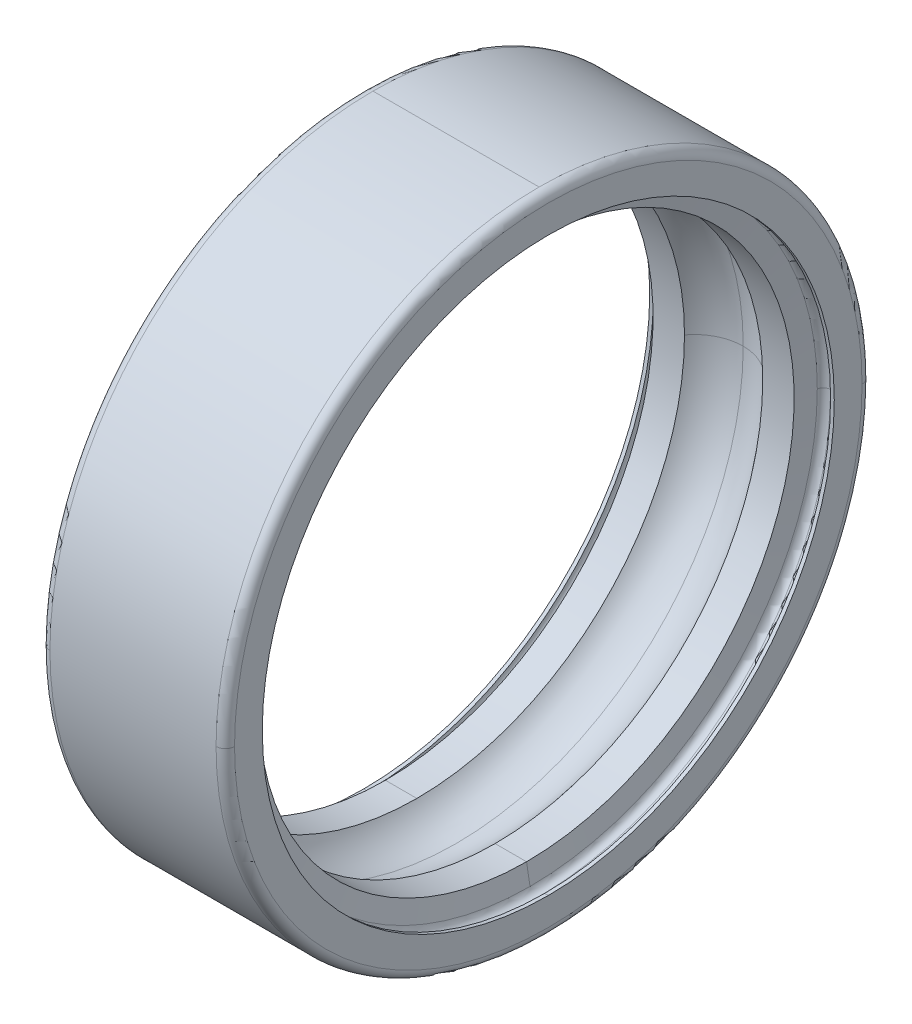
ISO-10303-21;
HEADER;
FILE_DESCRIPTION(('STEP AP214'),'2;1');
FILE_NAME('part.step','',(''),(''),'','','');
FILE_SCHEMA(('AUTOMOTIVE_DESIGN { 1 0 10303 214 1 1 1 1 }'));
ENDSEC;
DATA;
#1=APPLICATION_CONTEXT('core data for automotive mechanical design processes');
#2=APPLICATION_PROTOCOL_DEFINITION('international standard','automotive_design',2000,#1);
#3=PRODUCT_CONTEXT('',#1,'mechanical');
#4=PRODUCT('Part','Part','',(#3));
#5=PRODUCT_RELATED_PRODUCT_CATEGORY('part','',(#4));
#6=PRODUCT_DEFINITION_FORMATION('','',#4);
#7=PRODUCT_DEFINITION_CONTEXT('part definition',#1,'design');
#8=PRODUCT_DEFINITION('design','',#6,#7);
#9=PRODUCT_DEFINITION_SHAPE('','',#8);
#10=(LENGTH_UNIT() NAMED_UNIT(*) SI_UNIT(.MILLI.,.METRE.));
#11=(NAMED_UNIT(*) PLANE_ANGLE_UNIT() SI_UNIT($,.RADIAN.));
#12=(NAMED_UNIT(*) SI_UNIT($,.STERADIAN.) SOLID_ANGLE_UNIT());
#13=UNCERTAINTY_MEASURE_WITH_UNIT(LENGTH_MEASURE(1.E-05),#10,'distance_accuracy_value','');
#14=(GEOMETRIC_REPRESENTATION_CONTEXT(3) GLOBAL_UNCERTAINTY_ASSIGNED_CONTEXT((#13)) GLOBAL_UNIT_ASSIGNED_CONTEXT((#10,
#11,#12)) REPRESENTATION_CONTEXT('',''));
#15=CARTESIAN_POINT('',(0.,0.,0.));
#16=DIRECTION('',(0.,0.,1.));
#17=DIRECTION('',(1.,0.,0.));
#18=AXIS2_PLACEMENT_3D('',#15,#16,#17);
#19=CARTESIAN_POINT('',(11.283,0.,0.));
#20=DIRECTION('',(1.,0.,0.));
#21=DIRECTION('',(0.,0.,-1.));
#22=AXIS2_PLACEMENT_3D('',#19,#20,#21);
#23=TOROIDAL_SURFACE('',#22,18.595,0.478);
#24=CARTESIAN_POINT('',(11.283,0.,0.));
#25=DIRECTION('',(1.,0.,0.));
#26=DIRECTION('',(0.,0.,1.));
#27=AXIS2_PLACEMENT_3D('',#24,#25,#26);
#28=CIRCLE('',#27,19.073);
#29=CARTESIAN_POINT('',(11.283,0.,-19.073));
#30=VERTEX_POINT('',#29);
#31=CARTESIAN_POINT('',(11.283,0.,19.073));
#32=VERTEX_POINT('',#31);
#33=EDGE_CURVE('E452',#30,#32,#28,.T.);
#34=ORIENTED_EDGE('',*,*,#33,.T.);
#35=CARTESIAN_POINT('',(11.283,0.,18.595));
#36=DIRECTION('',(0.,-1.,0.));
#37=DIRECTION('',(0.,0.,1.));
#38=AXIS2_PLACEMENT_3D('',#35,#36,#37);
#39=CIRCLE('',#38,0.478);
#40=CARTESIAN_POINT('',(10.8122618940602,0.,18.6780038289248));
#41=VERTEX_POINT('',#40);
#42=EDGE_CURVE('E266',#32,#41,#39,.T.);
#43=ORIENTED_EDGE('',*,*,#42,.T.);
#44=CARTESIAN_POINT('',(10.8122618940602,0.,0.));
#45=DIRECTION('',(1.,0.,0.));
#46=DIRECTION('',(0.,1.,0.));
#47=AXIS2_PLACEMENT_3D('',#44,#45,#46);
#48=CIRCLE('',#47,18.6780038289248);
#49=CARTESIAN_POINT('',(10.8122618940602,18.6780038289248,0.));
#50=VERTEX_POINT('',#49);
#51=EDGE_CURVE('E30',#50,#41,#48,.T.);
#52=ORIENTED_EDGE('',*,*,#51,.F.);
#53=CARTESIAN_POINT('',(10.8122618940602,0.,0.));
#54=DIRECTION('',(1.,0.,0.));
#55=DIRECTION('',(0.,1.,0.));
#56=AXIS2_PLACEMENT_3D('',#53,#54,#55);
#57=CIRCLE('',#56,18.6780038289248);
#58=CARTESIAN_POINT('',(10.8122618940602,0.,-18.6780038289248));
#59=VERTEX_POINT('',#58);
#60=EDGE_CURVE('E357',#59,#50,#57,.T.);
#61=ORIENTED_EDGE('',*,*,#60,.F.);
#62=CARTESIAN_POINT('',(11.283,0.,-18.595));
#63=DIRECTION('',(0.,-1.,0.));
#64=DIRECTION('',(0.,0.,-1.));
#65=AXIS2_PLACEMENT_3D('',#62,#63,#64);
#66=CIRCLE('',#65,0.478);
#67=EDGE_CURVE('E252',#59,#30,#66,.T.);
#68=ORIENTED_EDGE('',*,*,#67,.T.);
#69=EDGE_LOOP('',(#34,#43,#52,#61,#68));
#70=FACE_BOUND('',#69,.T.);
#71=ADVANCED_FACE('F16',(#70),#23,.F.);
#72=CARTESIAN_POINT('',(11.8805,0.,0.));
#73=DIRECTION('',(1.,0.,0.));
#74=DIRECTION('',(0.,1.,0.));
#75=AXIS2_PLACEMENT_3D('',#72,#73,#74);
#76=CYLINDRICAL_SURFACE('',#75,18.595);
#77=DIRECTION('',(1.,0.,0.));
#78=VECTOR('',#77,1.);
#79=CARTESIAN_POINT('',(11.8805,18.595,0.));
#80=LINE('',#79,#78);
#81=CARTESIAN_POINT('',(11.761,18.595,0.));
#82=VERTEX_POINT('',#81);
#83=CARTESIAN_POINT('',(12.,18.595,0.));
#84=VERTEX_POINT('',#83);
#85=EDGE_CURVE('E268',#82,#84,#80,.T.);
#86=ORIENTED_EDGE('',*,*,#85,.T.);
#87=CARTESIAN_POINT('',(12.,0.,0.));
#88=DIRECTION('',(1.,0.,0.));
#89=DIRECTION('',(0.,1.,0.));
#90=AXIS2_PLACEMENT_3D('',#87,#88,#89);
#91=CIRCLE('',#90,18.595);
#92=CARTESIAN_POINT('',(12.,-18.595,0.));
#93=VERTEX_POINT('',#92);
#94=EDGE_CURVE('E11',#84,#93,#91,.T.);
#95=ORIENTED_EDGE('',*,*,#94,.T.);
#96=DIRECTION('',(-1.,0.,0.));
#97=VECTOR('',#96,1.);
#98=CARTESIAN_POINT('',(11.8805,-18.595,0.));
#99=LINE('',#98,#97);
#100=CARTESIAN_POINT('',(11.761,-18.595,0.));
#101=VERTEX_POINT('',#100);
#102=EDGE_CURVE('E276',#93,#101,#99,.T.);
#103=ORIENTED_EDGE('',*,*,#102,.T.);
#104=CARTESIAN_POINT('',(11.761,0.,0.));
#105=DIRECTION('',(1.,0.,0.));
#106=DIRECTION('',(0.,1.,0.));
#107=AXIS2_PLACEMENT_3D('',#104,#105,#106);
#108=CIRCLE('',#107,18.595);
#109=CARTESIAN_POINT('',(11.761,0.,18.595));
#110=VERTEX_POINT('',#109);
#111=EDGE_CURVE('E242',#110,#101,#108,.T.);
#112=ORIENTED_EDGE('',*,*,#111,.F.);
#113=CARTESIAN_POINT('',(11.761,0.,0.));
#114=DIRECTION('',(1.,0.,0.));
#115=DIRECTION('',(0.,1.,0.));
#116=AXIS2_PLACEMENT_3D('',#113,#114,#115);
#117=CIRCLE('',#116,18.595);
#118=EDGE_CURVE('E379',#82,#110,#117,.T.);
#119=ORIENTED_EDGE('',*,*,#118,.F.);
#120=EDGE_LOOP('',(#86,#95,#103,#112,#119));
#121=FACE_BOUND('',#120,.T.);
#122=ADVANCED_FACE('F467',(#121),#76,.F.);
#123=CARTESIAN_POINT('',(12.,19.4975,0.));
#124=DIRECTION('',(1.,0.,0.));
#125=DIRECTION('',(0.,1.,0.));
#126=AXIS2_PLACEMENT_3D('',#123,#124,#125);
#127=PLANE('',#126);
#128=ORIENTED_EDGE('',*,*,#94,.F.);
#129=CARTESIAN_POINT('',(12.,0.,0.));
#130=DIRECTION('',(1.,0.,0.));
#131=DIRECTION('',(0.,1.,0.));
#132=AXIS2_PLACEMENT_3D('',#129,#130,#131);
#133=CIRCLE('',#132,18.595);
#134=EDGE_CURVE('E281',#93,#84,#133,.T.);
#135=ORIENTED_EDGE('',*,*,#134,.F.);
#136=EDGE_LOOP('',(#128,#135));
#137=FACE_BOUND('',#136,.T.);
#138=CARTESIAN_POINT('',(12.,0.,0.));
#139=DIRECTION('',(1.,0.,0.));
#140=DIRECTION('',(0.,1.,0.));
#141=AXIS2_PLACEMENT_3D('',#138,#139,#140);
#142=CIRCLE('',#141,20.4);
#143=CARTESIAN_POINT('',(12.,0.,20.4));
#144=VERTEX_POINT('',#143);
#145=CARTESIAN_POINT('',(12.,0.,-20.4));
#146=VERTEX_POINT('',#145);
#147=EDGE_CURVE('E23',#144,#146,#142,.T.);
#148=ORIENTED_EDGE('',*,*,#147,.T.);
#149=CARTESIAN_POINT('',(12.,0.,0.));
#150=DIRECTION('',(1.,0.,0.));
#151=DIRECTION('',(0.,1.,0.));
#152=AXIS2_PLACEMENT_3D('',#149,#150,#151);
#153=CIRCLE('',#152,20.4);
#154=EDGE_CURVE('E294',#146,#144,#153,.T.);
#155=ORIENTED_EDGE('',*,*,#154,.T.);
#156=EDGE_LOOP('',(#148,#155));
#157=FACE_BOUND('',#156,.T.);
#158=ADVANCED_FACE('F469',(#137,#157),#127,.T.);
#159=CARTESIAN_POINT('',(11.4,0.,0.));
#160=DIRECTION('',(1.,0.,0.));
#161=DIRECTION('',(0.,0.,-1.));
#162=AXIS2_PLACEMENT_3D('',#159,#160,#161);
#163=TOROIDAL_SURFACE('',#162,20.4,0.6);
#164=CARTESIAN_POINT('',(11.4,0.,-20.4));
#165=DIRECTION('',(0.,-1.,0.));
#166=DIRECTION('',(0.,0.,-1.));
#167=AXIS2_PLACEMENT_3D('',#164,#165,#166);
#168=CIRCLE('',#167,0.6);
#169=CARTESIAN_POINT('',(11.4,0.,-21.));
#170=VERTEX_POINT('',#169);
#171=EDGE_CURVE('E284',#170,#146,#168,.T.);
#172=ORIENTED_EDGE('',*,*,#171,.T.);
#173=ORIENTED_EDGE('',*,*,#147,.F.);
#174=CARTESIAN_POINT('',(11.4,0.,20.4));
#175=DIRECTION('',(0.,-1.,0.));
#176=DIRECTION('',(0.,0.,1.));
#177=AXIS2_PLACEMENT_3D('',#174,#175,#176);
#178=CIRCLE('',#177,0.6);
#179=CARTESIAN_POINT('',(11.4,0.,21.));
#180=VERTEX_POINT('',#179);
#181=EDGE_CURVE('E291',#144,#180,#178,.T.);
#182=ORIENTED_EDGE('',*,*,#181,.T.);
#183=CARTESIAN_POINT('',(11.4,0.,0.));
#184=DIRECTION('',(1.,0.,0.));
#185=DIRECTION('',(0.,1.,0.));
#186=AXIS2_PLACEMENT_3D('',#183,#184,#185);
#187=CIRCLE('',#186,21.);
#188=CARTESIAN_POINT('',(11.4,-21.,0.));
#189=VERTEX_POINT('',#188);
#190=EDGE_CURVE('E308',#180,#189,#187,.T.);
#191=ORIENTED_EDGE('',*,*,#190,.T.);
#192=CARTESIAN_POINT('',(11.4,0.,0.));
#193=DIRECTION('',(1.,0.,0.));
#194=DIRECTION('',(0.,1.,0.));
#195=AXIS2_PLACEMENT_3D('',#192,#193,#194);
#196=CIRCLE('',#195,21.);
#197=EDGE_CURVE('E333',#189,#170,#196,.T.);
#198=ORIENTED_EDGE('',*,*,#197,.T.);
#199=EDGE_LOOP('',(#172,#173,#182,#191,#198));
#200=FACE_BOUND('',#199,.T.);
#201=ADVANCED_FACE('F472',(#200),#163,.T.);
#202=CARTESIAN_POINT('',(6.,0.,0.));
#203=DIRECTION('',(1.,0.,0.));
#204=DIRECTION('',(0.,1.,0.));
#205=AXIS2_PLACEMENT_3D('',#202,#203,#204);
#206=CYLINDRICAL_SURFACE('',#205,21.);
#207=DIRECTION('',(1.,0.,0.));
#208=VECTOR('',#207,1.);
#209=CARTESIAN_POINT('',(6.,21.,0.));
#210=LINE('',#209,#208);
#211=CARTESIAN_POINT('',(0.6,21.,0.));
#212=VERTEX_POINT('',#211);
#213=CARTESIAN_POINT('',(11.4,21.,0.));
#214=VERTEX_POINT('',#213);
#215=EDGE_CURVE('E297',#212,#214,#210,.T.);
#216=ORIENTED_EDGE('',*,*,#215,.T.);
#217=CARTESIAN_POINT('',(11.4,0.,0.));
#218=DIRECTION('',(1.,0.,0.));
#219=DIRECTION('',(0.,1.,0.));
#220=AXIS2_PLACEMENT_3D('',#217,#218,#219);
#221=CIRCLE('',#220,21.);
#222=EDGE_CURVE('E285',#170,#214,#221,.T.);
#223=ORIENTED_EDGE('',*,*,#222,.F.);
#224=ORIENTED_EDGE('',*,*,#197,.F.);
#225=DIRECTION('',(-1.,0.,0.));
#226=VECTOR('',#225,1.);
#227=CARTESIAN_POINT('',(6.,-21.,0.));
#228=LINE('',#227,#226);
#229=CARTESIAN_POINT('',(0.6,-21.,0.));
#230=VERTEX_POINT('',#229);
#231=EDGE_CURVE('E305',#189,#230,#228,.T.);
#232=ORIENTED_EDGE('',*,*,#231,.T.);
#233=CARTESIAN_POINT('',(0.6,0.,0.));
#234=DIRECTION('',(1.,0.,0.));
#235=DIRECTION('',(0.,1.,0.));
#236=AXIS2_PLACEMENT_3D('',#233,#234,#235);
#237=CIRCLE('',#236,21.);
#238=CARTESIAN_POINT('',(0.6,0.,-21.));
#239=VERTEX_POINT('',#238);
#240=EDGE_CURVE('E364',#230,#239,#237,.T.);
#241=ORIENTED_EDGE('',*,*,#240,.T.);
#242=CARTESIAN_POINT('',(0.6,0.,0.));
#243=DIRECTION('',(1.,0.,0.));
#244=DIRECTION('',(0.,1.,0.));
#245=AXIS2_PLACEMENT_3D('',#242,#243,#244);
#246=CIRCLE('',#245,21.);
#247=EDGE_CURVE('E324',#239,#212,#246,.T.);
#248=ORIENTED_EDGE('',*,*,#247,.T.);
#249=EDGE_LOOP('',(#216,#223,#224,#232,#241,#248));
#250=FACE_BOUND('',#249,.T.);
#251=ADVANCED_FACE('F480',(#250),#206,.T.);
#252=CARTESIAN_POINT('',(0.6,0.,0.));
#253=DIRECTION('',(1.,0.,0.));
#254=DIRECTION('',(0.,0.,-1.));
#255=AXIS2_PLACEMENT_3D('',#252,#253,#254);
#256=TOROIDAL_SURFACE('',#255,20.4,0.6);
#257=CARTESIAN_POINT('',(0.6,0.,-20.4));
#258=DIRECTION('',(0.,-1.,0.));
#259=DIRECTION('',(0.,0.,-1.));
#260=AXIS2_PLACEMENT_3D('',#257,#258,#259);
#261=CIRCLE('',#260,0.6);
#262=CARTESIAN_POINT('',(0.,0.,-20.4));
#263=VERTEX_POINT('',#262);
#264=EDGE_CURVE('E311',#263,#239,#261,.T.);
#265=ORIENTED_EDGE('',*,*,#264,.T.);
#266=ORIENTED_EDGE('',*,*,#240,.F.);
#267=CARTESIAN_POINT('',(0.6,0.,0.));
#268=DIRECTION('',(1.,0.,0.));
#269=DIRECTION('',(0.,1.,0.));
#270=AXIS2_PLACEMENT_3D('',#267,#268,#269);
#271=CIRCLE('',#270,21.);
#272=CARTESIAN_POINT('',(0.6,0.,21.));
#273=VERTEX_POINT('',#272);
#274=EDGE_CURVE('E302',#273,#230,#271,.T.);
#275=ORIENTED_EDGE('',*,*,#274,.F.);
#276=CARTESIAN_POINT('',(0.6,0.,20.4));
#277=DIRECTION('',(0.,-1.,0.));
#278=DIRECTION('',(0.,0.,1.));
#279=AXIS2_PLACEMENT_3D('',#276,#277,#278);
#280=CIRCLE('',#279,0.6);
#281=CARTESIAN_POINT('',(0.,0.,20.4));
#282=VERTEX_POINT('',#281);
#283=EDGE_CURVE('E321',#273,#282,#280,.T.);
#284=ORIENTED_EDGE('',*,*,#283,.T.);
#285=CARTESIAN_POINT('',(0.,0.,0.));
#286=DIRECTION('',(1.,0.,0.));
#287=DIRECTION('',(0.,1.,0.));
#288=AXIS2_PLACEMENT_3D('',#285,#286,#287);
#289=CIRCLE('',#288,20.4);
#290=EDGE_CURVE('E363',#282,#263,#289,.T.);
#291=ORIENTED_EDGE('',*,*,#290,.T.);
#292=EDGE_LOOP('',(#265,#266,#275,#284,#291));
#293=FACE_BOUND('',#292,.T.);
#294=ADVANCED_FACE('F486',(#293),#256,.T.);
#295=CARTESIAN_POINT('',(0.,19.4975,0.));
#296=DIRECTION('',(-1.,0.,0.));
#297=DIRECTION('',(0.,0.,1.));
#298=AXIS2_PLACEMENT_3D('',#295,#296,#297);
#299=PLANE('',#298);
#300=CARTESIAN_POINT('',(0.,0.,0.));
#301=DIRECTION('',(1.,0.,0.));
#302=DIRECTION('',(0.,1.,0.));
#303=AXIS2_PLACEMENT_3D('',#300,#301,#302);
#304=CIRCLE('',#303,18.595);
#305=CARTESIAN_POINT('',(0.,18.595,0.));
#306=VERTEX_POINT('',#305);
#307=CARTESIAN_POINT('',(0.,-18.595,0.));
#308=VERTEX_POINT('',#307);
#309=EDGE_CURVE('E317',#306,#308,#304,.T.);
#310=ORIENTED_EDGE('',*,*,#309,.T.);
#311=CARTESIAN_POINT('',(0.,0.,0.));
#312=DIRECTION('',(1.,0.,0.));
#313=DIRECTION('',(0.,1.,0.));
#314=AXIS2_PLACEMENT_3D('',#311,#312,#313);
#315=CIRCLE('',#314,18.595);
#316=EDGE_CURVE('E219',#308,#306,#315,.T.);
#317=ORIENTED_EDGE('',*,*,#316,.T.);
#318=EDGE_LOOP('',(#310,#317));
#319=FACE_BOUND('',#318,.T.);
#320=CARTESIAN_POINT('',(0.,0.,0.));
#321=DIRECTION('',(1.,0.,0.));
#322=DIRECTION('',(0.,1.,0.));
#323=AXIS2_PLACEMENT_3D('',#320,#321,#322);
#324=CIRCLE('',#323,20.4);
#325=EDGE_CURVE('E314',#263,#282,#324,.T.);
#326=ORIENTED_EDGE('',*,*,#325,.F.);
#327=ORIENTED_EDGE('',*,*,#290,.F.);
#328=EDGE_LOOP('',(#326,#327));
#329=FACE_BOUND('',#328,.T.);
#330=ADVANCED_FACE('F522',(#319,#329),#299,.T.);
#331=CARTESIAN_POINT('',(0.1195,0.,0.));
#332=DIRECTION('',(1.,0.,0.));
#333=DIRECTION('',(0.,1.,0.));
#334=AXIS2_PLACEMENT_3D('',#331,#332,#333);
#335=CYLINDRICAL_SURFACE('',#334,18.595);
#336=DIRECTION('',(1.,0.,0.));
#337=VECTOR('',#336,1.);
#338=CARTESIAN_POINT('',(0.1195,18.595,0.));
#339=LINE('',#338,#337);
#340=CARTESIAN_POINT('',(0.239,18.595,0.));
#341=VERTEX_POINT('',#340);
#342=EDGE_CURVE('E223',#306,#341,#339,.T.);
#343=ORIENTED_EDGE('',*,*,#342,.T.);
#344=CARTESIAN_POINT('',(0.239,0.,0.));
#345=DIRECTION('',(1.,0.,0.));
#346=DIRECTION('',(0.,1.,0.));
#347=AXIS2_PLACEMENT_3D('',#344,#345,#346);
#348=CIRCLE('',#347,18.595);
#349=CARTESIAN_POINT('',(0.239,0.,18.595));
#350=VERTEX_POINT('',#349);
#351=EDGE_CURVE('E315',#341,#350,#348,.T.);
#352=ORIENTED_EDGE('',*,*,#351,.T.);
#353=CARTESIAN_POINT('',(0.239,0.,0.));
#354=DIRECTION('',(1.,0.,0.));
#355=DIRECTION('',(0.,1.,0.));
#356=AXIS2_PLACEMENT_3D('',#353,#354,#355);
#357=CIRCLE('',#356,18.595);
#358=CARTESIAN_POINT('',(0.239,-18.595,0.));
#359=VERTEX_POINT('',#358);
#360=EDGE_CURVE('E247',#350,#359,#357,.T.);
#361=ORIENTED_EDGE('',*,*,#360,.T.);
#362=DIRECTION('',(-1.,0.,0.));
#363=VECTOR('',#362,1.);
#364=CARTESIAN_POINT('',(0.1195,-18.595,0.));
#365=LINE('',#364,#363);
#366=EDGE_CURVE('E222',#359,#308,#365,.T.);
#367=ORIENTED_EDGE('',*,*,#366,.T.);
#368=ORIENTED_EDGE('',*,*,#309,.F.);
#369=EDGE_LOOP('',(#343,#352,#361,#367,#368));
#370=FACE_BOUND('',#369,.T.);
#371=ADVANCED_FACE('F532',(#370),#335,.F.);
#372=CARTESIAN_POINT('',(0.717,0.,0.));
#373=DIRECTION('',(1.,0.,0.));
#374=DIRECTION('',(0.,0.,-1.));
#375=AXIS2_PLACEMENT_3D('',#372,#373,#374);
#376=TOROIDAL_SURFACE('',#375,18.595,0.478);
#377=CARTESIAN_POINT('',(0.717,0.,0.));
#378=DIRECTION('',(1.,0.,0.));
#379=DIRECTION('',(0.,0.,1.));
#380=AXIS2_PLACEMENT_3D('',#377,#378,#379);
#381=CIRCLE('',#380,19.073);
#382=CARTESIAN_POINT('',(0.717,0.,-19.073));
#383=VERTEX_POINT('',#382);
#384=CARTESIAN_POINT('',(0.717,0.,19.073));
#385=VERTEX_POINT('',#384);
#386=EDGE_CURVE('E386',#383,#385,#381,.T.);
#387=ORIENTED_EDGE('',*,*,#386,.T.);
#388=CARTESIAN_POINT('',(0.717,0.,18.595));
#389=DIRECTION('',(0.,-1.,0.));
#390=DIRECTION('',(0.,0.,1.));
#391=AXIS2_PLACEMENT_3D('',#388,#389,#390);
#392=CIRCLE('',#391,0.478);
#393=EDGE_CURVE('E243',#385,#350,#392,.T.);
#394=ORIENTED_EDGE('',*,*,#393,.T.);
#395=ORIENTED_EDGE('',*,*,#351,.F.);
#396=CARTESIAN_POINT('',(0.239,0.,0.));
#397=DIRECTION('',(1.,0.,0.));
#398=DIRECTION('',(0.,1.,0.));
#399=AXIS2_PLACEMENT_3D('',#396,#397,#398);
#400=CIRCLE('',#399,18.595);
#401=CARTESIAN_POINT('',(0.239,0.,-18.595));
#402=VERTEX_POINT('',#401);
#403=EDGE_CURVE('E231',#402,#341,#400,.T.);
#404=ORIENTED_EDGE('',*,*,#403,.F.);
#405=CARTESIAN_POINT('',(0.717,0.,-18.595));
#406=DIRECTION('',(0.,-1.,0.));
#407=DIRECTION('',(0.,0.,-1.));
#408=AXIS2_PLACEMENT_3D('',#405,#406,#407);
#409=CIRCLE('',#408,0.478);
#410=EDGE_CURVE('E234',#402,#383,#409,.T.);
#411=ORIENTED_EDGE('',*,*,#410,.T.);
#412=EDGE_LOOP('',(#387,#394,#395,#404,#411));
#413=FACE_BOUND('',#412,.T.);
#414=ADVANCED_FACE('F407',(#413),#376,.F.);
#415=CARTESIAN_POINT('',(1.30041138418392,0.,0.));
#416=DIRECTION('',(-1.,0.,0.));
#417=DIRECTION('',(0.,1.,0.));
#418=AXIS2_PLACEMENT_3D('',#415,#416,#417);
#419=CONICAL_SURFACE('',#418,18.0390019144624,1.39626340159546);
#420=DIRECTION('',(0.173648177666931,-0.984807753012208,0.));
#421=VECTOR('',#420,1.);
#422=CARTESIAN_POINT('',(1.30041138418392,18.0390019144624,0.));
#423=LINE('',#422,#421);
#424=CARTESIAN_POINT('',(1.18773810593984,18.6780038289248,0.));
#425=VERTEX_POINT('',#424);
#426=CARTESIAN_POINT('',(1.413084662428,17.4,0.));
#427=VERTEX_POINT('',#426);
#428=EDGE_CURVE('E246',#425,#427,#423,.T.);
#429=ORIENTED_EDGE('',*,*,#428,.T.);
#430=CARTESIAN_POINT('',(1.413084662428,0.,0.));
#431=DIRECTION('',(1.,0.,0.));
#432=DIRECTION('',(0.,1.,0.));
#433=AXIS2_PLACEMENT_3D('',#430,#431,#432);
#434=CIRCLE('',#433,17.4);
#435=CARTESIAN_POINT('',(1.413084662428,-17.4,0.));
#436=VERTEX_POINT('',#435);
#437=EDGE_CURVE('E318',#427,#436,#434,.T.);
#438=ORIENTED_EDGE('',*,*,#437,.T.);
#439=DIRECTION('',(-0.173648177666931,-0.984807753012208,0.));
#440=VECTOR('',#439,1.);
#441=CARTESIAN_POINT('',(1.30041138418392,-18.0390019144624,0.));
#442=LINE('',#441,#440);
#443=CARTESIAN_POINT('',(1.18773810593984,-18.6780038289248,0.));
#444=VERTEX_POINT('',#443);
#445=EDGE_CURVE('E253',#436,#444,#442,.T.);
#446=ORIENTED_EDGE('',*,*,#445,.T.);
#447=CARTESIAN_POINT('',(1.18773810593984,0.,0.));
#448=DIRECTION('',(1.,0.,0.));
#449=DIRECTION('',(0.,1.,0.));
#450=AXIS2_PLACEMENT_3D('',#447,#448,#449);
#451=CIRCLE('',#450,18.6780038289248);
#452=CARTESIAN_POINT('',(1.18773810593984,0.,18.6780038289248));
#453=VERTEX_POINT('',#452);
#454=EDGE_CURVE('E230',#453,#444,#451,.T.);
#455=ORIENTED_EDGE('',*,*,#454,.F.);
#456=CARTESIAN_POINT('',(1.18773810593984,0.,0.));
#457=DIRECTION('',(1.,0.,0.));
#458=DIRECTION('',(0.,1.,0.));
#459=AXIS2_PLACEMENT_3D('',#456,#457,#458);
#460=CIRCLE('',#459,18.6780038289248);
#461=EDGE_CURVE('E395',#425,#453,#460,.T.);
#462=ORIENTED_EDGE('',*,*,#461,.F.);
#463=EDGE_LOOP('',(#429,#438,#446,#455,#462));
#464=FACE_BOUND('',#463,.T.);
#465=ADVANCED_FACE('F422',(#464),#419,.F.);
#466=CARTESIAN_POINT('',(2.43467117028613,0.,0.));
#467=DIRECTION('',(1.,0.,0.));
#468=DIRECTION('',(0.,1.,0.));
#469=AXIS2_PLACEMENT_3D('',#466,#467,#468);
#470=CYLINDRICAL_SURFACE('',#469,17.4);
#471=DIRECTION('',(1.,0.,0.));
#472=VECTOR('',#471,1.);
#473=CARTESIAN_POINT('',(2.43467117028613,17.4,0.));
#474=LINE('',#473,#472);
#475=CARTESIAN_POINT('',(3.45625767814426,17.4,0.));
#476=VERTEX_POINT('',#475);
#477=EDGE_CURVE('E260',#427,#476,#474,.T.);
#478=ORIENTED_EDGE('',*,*,#477,.T.);
#479=CARTESIAN_POINT('',(3.45625767814426,0.,0.));
#480=DIRECTION('',(1.,0.,0.));
#481=DIRECTION('',(0.,1.,0.));
#482=AXIS2_PLACEMENT_3D('',#479,#480,#481);
#483=CIRCLE('',#482,17.4);
#484=CARTESIAN_POINT('',(3.45625767814426,0.,17.4));
#485=VERTEX_POINT('',#484);
#486=EDGE_CURVE('E326',#476,#485,#483,.T.);
#487=ORIENTED_EDGE('',*,*,#486,.T.);
#488=CARTESIAN_POINT('',(3.45625767814426,0.,0.));
#489=DIRECTION('',(1.,0.,0.));
#490=DIRECTION('',(0.,1.,0.));
#491=AXIS2_PLACEMENT_3D('',#488,#489,#490);
#492=CIRCLE('',#491,17.4);
#493=CARTESIAN_POINT('',(3.45625767814426,-17.4,0.));
#494=VERTEX_POINT('',#493);
#495=EDGE_CURVE('E343',#485,#494,#492,.T.);
#496=ORIENTED_EDGE('',*,*,#495,.T.);
#497=DIRECTION('',(-1.,0.,0.));
#498=VECTOR('',#497,1.);
#499=CARTESIAN_POINT('',(2.43467117028613,-17.4,0.));
#500=LINE('',#499,#498);
#501=EDGE_CURVE('E273',#494,#436,#500,.T.);
#502=ORIENTED_EDGE('',*,*,#501,.T.);
#503=ORIENTED_EDGE('',*,*,#437,.F.);
#504=EDGE_LOOP('',(#478,#487,#496,#502,#503));
#505=FACE_BOUND('',#504,.T.);
#506=ADVANCED_FACE('F426',(#505),#470,.F.);
#507=CARTESIAN_POINT('',(6.,0.,0.));
#508=DIRECTION('',(1.,0.,0.));
#509=DIRECTION('',(0.,0.,-1.));
#510=AXIS2_PLACEMENT_3D('',#507,#508,#509);
#511=TOROIDAL_SURFACE('',#510,15.5,3.175);
#512=CARTESIAN_POINT('',(6.,0.,0.));
#513=DIRECTION('',(1.,0.,0.));
#514=DIRECTION('',(0.,0.,1.));
#515=AXIS2_PLACEMENT_3D('',#512,#513,#514);
#516=CIRCLE('',#515,18.675);
#517=CARTESIAN_POINT('',(6.,0.,-18.675));
#518=VERTEX_POINT('',#517);
#519=CARTESIAN_POINT('',(6.,0.,18.675));
#520=VERTEX_POINT('',#519);
#521=EDGE_CURVE('E208',#518,#520,#516,.T.);
#522=ORIENTED_EDGE('',*,*,#521,.T.);
#523=CARTESIAN_POINT('',(6.,0.,15.5));
#524=DIRECTION('',(0.,-1.,0.));
#525=DIRECTION('',(0.,0.,1.));
#526=AXIS2_PLACEMENT_3D('',#523,#524,#525);
#527=CIRCLE('',#526,3.175);
#528=EDGE_CURVE('E345',#520,#485,#527,.T.);
#529=ORIENTED_EDGE('',*,*,#528,.T.);
#530=ORIENTED_EDGE('',*,*,#486,.F.);
#531=CARTESIAN_POINT('',(3.45625767814426,0.,0.));
#532=DIRECTION('',(1.,0.,0.));
#533=DIRECTION('',(0.,1.,0.));
#534=AXIS2_PLACEMENT_3D('',#531,#532,#533);
#535=CIRCLE('',#534,17.4);
#536=CARTESIAN_POINT('',(3.45625767814426,0.,-17.4));
#537=VERTEX_POINT('',#536);
#538=EDGE_CURVE('E272',#537,#476,#535,.T.);
#539=ORIENTED_EDGE('',*,*,#538,.F.);
#540=CARTESIAN_POINT('',(6.,0.,-15.5));
#541=DIRECTION('',(0.,-1.,0.));
#542=DIRECTION('',(0.,0.,-1.));
#543=AXIS2_PLACEMENT_3D('',#540,#541,#542);
#544=CIRCLE('',#543,3.175);
#545=EDGE_CURVE('E279',#537,#518,#544,.T.);
#546=ORIENTED_EDGE('',*,*,#545,.T.);
#547=EDGE_LOOP('',(#522,#529,#530,#539,#546));
#548=FACE_BOUND('',#547,.T.);
#549=ADVANCED_FACE('F433',(#548),#511,.F.);
#550=CARTESIAN_POINT('',(9.56532882971387,0.,0.));
#551=DIRECTION('',(1.,0.,0.));
#552=DIRECTION('',(0.,1.,0.));
#553=AXIS2_PLACEMENT_3D('',#550,#551,#552);
#554=CYLINDRICAL_SURFACE('',#553,17.4);
#555=DIRECTION('',(1.,0.,0.));
#556=VECTOR('',#555,1.);
#557=CARTESIAN_POINT('',(9.56532882971387,17.4,0.));
#558=LINE('',#557,#556);
#559=CARTESIAN_POINT('',(8.54374232185574,17.4,0.));
#560=VERTEX_POINT('',#559);
#561=CARTESIAN_POINT('',(10.586915337572,17.4,0.));
#562=VERTEX_POINT('',#561);
#563=EDGE_CURVE('E199',#560,#562,#558,.T.);
#564=ORIENTED_EDGE('',*,*,#563,.T.);
#565=CARTESIAN_POINT('',(10.586915337572,0.,0.));
#566=DIRECTION('',(1.,0.,0.));
#567=DIRECTION('',(0.,1.,0.));
#568=AXIS2_PLACEMENT_3D('',#565,#566,#567);
#569=CIRCLE('',#568,17.4);
#570=CARTESIAN_POINT('',(10.586915337572,-17.4,0.));
#571=VERTEX_POINT('',#570);
#572=EDGE_CURVE('E38',#562,#571,#569,.T.);
#573=ORIENTED_EDGE('',*,*,#572,.T.);
#574=DIRECTION('',(-1.,0.,0.));
#575=VECTOR('',#574,1.);
#576=CARTESIAN_POINT('',(9.56532882971387,-17.4,0.));
#577=LINE('',#576,#575);
#578=CARTESIAN_POINT('',(8.54374232185573,-17.4,0.));
#579=VERTEX_POINT('',#578);
#580=EDGE_CURVE('E348',#571,#579,#577,.T.);
#581=ORIENTED_EDGE('',*,*,#580,.T.);
#582=CARTESIAN_POINT('',(8.54374232185574,0.,0.));
#583=DIRECTION('',(1.,0.,0.));
#584=DIRECTION('',(0.,1.,0.));
#585=AXIS2_PLACEMENT_3D('',#582,#583,#584);
#586=CIRCLE('',#585,17.4);
#587=CARTESIAN_POINT('',(8.54374232185574,0.,17.4));
#588=VERTEX_POINT('',#587);
#589=EDGE_CURVE('E190',#588,#579,#586,.T.);
#590=ORIENTED_EDGE('',*,*,#589,.F.);
#591=CARTESIAN_POINT('',(8.54374232185574,0.,0.));
#592=DIRECTION('',(1.,0.,0.));
#593=DIRECTION('',(0.,1.,0.));
#594=AXIS2_PLACEMENT_3D('',#591,#592,#593);
#595=CIRCLE('',#594,17.4);
#596=EDGE_CURVE('E203',#560,#588,#595,.T.);
#597=ORIENTED_EDGE('',*,*,#596,.F.);
#598=EDGE_LOOP('',(#564,#573,#581,#590,#597));
#599=FACE_BOUND('',#598,.T.);
#600=ADVANCED_FACE('F436',(#599),#554,.F.);
#601=CARTESIAN_POINT('',(10.6995886158161,0.,0.));
#602=DIRECTION('',(1.,0.,0.));
#603=DIRECTION('',(0.,1.,0.));
#604=AXIS2_PLACEMENT_3D('',#601,#602,#603);
#605=CONICAL_SURFACE('',#604,18.0390019144624,1.39626340159546);
#606=DIRECTION('',(0.17364817766693,0.984807753012208,0.));
#607=VECTOR('',#606,1.);
#608=CARTESIAN_POINT('',(10.6995886158161,18.0390019144624,0.));
#609=LINE('',#608,#607);
#610=EDGE_CURVE('E352',#562,#50,#609,.T.);
#611=ORIENTED_EDGE('',*,*,#610,.T.);
#612=ORIENTED_EDGE('',*,*,#51,.T.);
#613=CARTESIAN_POINT('',(10.8122618940602,0.,0.));
#614=DIRECTION('',(1.,0.,0.));
#615=DIRECTION('',(0.,1.,0.));
#616=AXIS2_PLACEMENT_3D('',#613,#614,#615);
#617=CIRCLE('',#616,18.6780038289248);
#618=CARTESIAN_POINT('',(10.8122618940602,-18.6780038289248,0.));
#619=VERTEX_POINT('',#618);
#620=EDGE_CURVE('E263',#41,#619,#617,.T.);
#621=ORIENTED_EDGE('',*,*,#620,.T.);
#622=DIRECTION('',(-0.17364817766693,0.984807753012208,0.));
#623=VECTOR('',#622,1.);
#624=CARTESIAN_POINT('',(10.6995886158161,-18.0390019144624,0.));
#625=LINE('',#624,#623);
#626=EDGE_CURVE('E355',#619,#571,#625,.T.);
#627=ORIENTED_EDGE('',*,*,#626,.T.);
#628=ORIENTED_EDGE('',*,*,#572,.F.);
#629=EDGE_LOOP('',(#611,#612,#621,#627,#628));
#630=FACE_BOUND('',#629,.T.);
#631=ADVANCED_FACE('F442',(#630),#605,.F.);
#632=CARTESIAN_POINT('',(10.6995886158161,0.,0.));
#633=DIRECTION('',(1.,0.,0.));
#634=DIRECTION('',(0.,1.,0.));
#635=AXIS2_PLACEMENT_3D('',#632,#633,#634);
#636=CONICAL_SURFACE('',#635,18.0390019144624,1.39626340159546);
#637=ORIENTED_EDGE('',*,*,#610,.F.);
#638=CARTESIAN_POINT('',(10.586915337572,0.,0.));
#639=DIRECTION('',(1.,0.,0.));
#640=DIRECTION('',(0.,1.,0.));
#641=AXIS2_PLACEMENT_3D('',#638,#639,#640);
#642=CIRCLE('',#641,17.4);
#643=EDGE_CURVE('E350',#571,#562,#642,.T.);
#644=ORIENTED_EDGE('',*,*,#643,.F.);
#645=ORIENTED_EDGE('',*,*,#626,.F.);
#646=CARTESIAN_POINT('',(10.8122618940602,0.,0.));
#647=DIRECTION('',(1.,0.,0.));
#648=DIRECTION('',(0.,1.,0.));
#649=AXIS2_PLACEMENT_3D('',#646,#647,#648);
#650=CIRCLE('',#649,18.6780038289248);
#651=EDGE_CURVE('E257',#619,#59,#650,.T.);
#652=ORIENTED_EDGE('',*,*,#651,.T.);
#653=ORIENTED_EDGE('',*,*,#60,.T.);
#654=EDGE_LOOP('',(#637,#644,#645,#652,#653));
#655=FACE_BOUND('',#654,.T.);
#656=ADVANCED_FACE('F440',(#655),#636,.F.);
#657=CARTESIAN_POINT('',(9.56532882971387,0.,0.));
#658=DIRECTION('',(1.,0.,0.));
#659=DIRECTION('',(0.,1.,0.));
#660=AXIS2_PLACEMENT_3D('',#657,#658,#659);
#661=CYLINDRICAL_SURFACE('',#660,17.4);
#662=ORIENTED_EDGE('',*,*,#563,.F.);
#663=CARTESIAN_POINT('',(8.54374232185574,0.,0.));
#664=DIRECTION('',(1.,0.,0.));
#665=DIRECTION('',(0.,1.,0.));
#666=AXIS2_PLACEMENT_3D('',#663,#664,#665);
#667=CIRCLE('',#666,17.4);
#668=CARTESIAN_POINT('',(8.54374232185574,0.,-17.4));
#669=VERTEX_POINT('',#668);
#670=EDGE_CURVE('E196',#669,#560,#667,.T.);
#671=ORIENTED_EDGE('',*,*,#670,.F.);
#672=CARTESIAN_POINT('',(8.54374232185574,0.,0.));
#673=DIRECTION('',(1.,0.,0.));
#674=DIRECTION('',(0.,1.,0.));
#675=AXIS2_PLACEMENT_3D('',#672,#673,#674);
#676=CIRCLE('',#675,17.4);
#677=EDGE_CURVE('E182',#579,#669,#676,.T.);
#678=ORIENTED_EDGE('',*,*,#677,.F.);
#679=ORIENTED_EDGE('',*,*,#580,.F.);
#680=ORIENTED_EDGE('',*,*,#643,.T.);
#681=EDGE_LOOP('',(#662,#671,#678,#679,#680));
#682=FACE_BOUND('',#681,.T.);
#683=ADVANCED_FACE('F197',(#682),#661,.F.);
#684=CARTESIAN_POINT('',(6.,0.,0.));
#685=DIRECTION('',(1.,0.,0.));
#686=DIRECTION('',(0.,0.,-1.));
#687=AXIS2_PLACEMENT_3D('',#684,#685,#686);
#688=TOROIDAL_SURFACE('',#687,15.5,3.175);
#689=CARTESIAN_POINT('',(6.,0.,0.));
#690=DIRECTION('',(1.,0.,0.));
#691=DIRECTION('',(0.,0.,1.));
#692=AXIS2_PLACEMENT_3D('',#689,#690,#691);
#693=CIRCLE('',#692,18.675);
#694=EDGE_CURVE('E218',#520,#518,#693,.T.);
#695=ORIENTED_EDGE('',*,*,#694,.T.);
#696=ORIENTED_EDGE('',*,*,#545,.F.);
#697=CARTESIAN_POINT('',(3.45625767814426,0.,0.));
#698=DIRECTION('',(1.,0.,0.));
#699=DIRECTION('',(0.,1.,0.));
#700=AXIS2_PLACEMENT_3D('',#697,#698,#699);
#701=CIRCLE('',#700,17.4);
#702=EDGE_CURVE('E269',#494,#537,#701,.T.);
#703=ORIENTED_EDGE('',*,*,#702,.F.);
#704=ORIENTED_EDGE('',*,*,#495,.F.);
#705=ORIENTED_EDGE('',*,*,#528,.F.);
#706=EDGE_LOOP('',(#695,#696,#703,#704,#705));
#707=FACE_BOUND('',#706,.T.);
#708=ADVANCED_FACE('F435',(#707),#688,.F.);
#709=CARTESIAN_POINT('',(2.43467117028613,0.,0.));
#710=DIRECTION('',(1.,0.,0.));
#711=DIRECTION('',(0.,1.,0.));
#712=AXIS2_PLACEMENT_3D('',#709,#710,#711);
#713=CYLINDRICAL_SURFACE('',#712,17.4);
#714=ORIENTED_EDGE('',*,*,#477,.F.);
#715=CARTESIAN_POINT('',(1.413084662428,0.,0.));
#716=DIRECTION('',(1.,0.,0.));
#717=DIRECTION('',(0.,1.,0.));
#718=AXIS2_PLACEMENT_3D('',#715,#716,#717);
#719=CIRCLE('',#718,17.4);
#720=EDGE_CURVE('E255',#436,#427,#719,.T.);
#721=ORIENTED_EDGE('',*,*,#720,.F.);
#722=ORIENTED_EDGE('',*,*,#501,.F.);
#723=ORIENTED_EDGE('',*,*,#702,.T.);
#724=ORIENTED_EDGE('',*,*,#538,.T.);
#725=EDGE_LOOP('',(#714,#721,#722,#723,#724));
#726=FACE_BOUND('',#725,.T.);
#727=ADVANCED_FACE('F430',(#726),#713,.F.);
#728=CARTESIAN_POINT('',(1.30041138418392,0.,0.));
#729=DIRECTION('',(-1.,0.,0.));
#730=DIRECTION('',(0.,1.,0.));
#731=AXIS2_PLACEMENT_3D('',#728,#729,#730);
#732=CONICAL_SURFACE('',#731,18.0390019144624,1.39626340159546);
#733=ORIENTED_EDGE('',*,*,#428,.F.);
#734=CARTESIAN_POINT('',(1.18773810593984,0.,0.));
#735=DIRECTION('',(1.,0.,0.));
#736=DIRECTION('',(0.,1.,0.));
#737=AXIS2_PLACEMENT_3D('',#734,#735,#736);
#738=CIRCLE('',#737,18.6780038289248);
#739=CARTESIAN_POINT('',(1.18773810593984,0.,-18.6780038289248));
#740=VERTEX_POINT('',#739);
#741=EDGE_CURVE('E392',#740,#425,#738,.T.);
#742=ORIENTED_EDGE('',*,*,#741,.F.);
#743=CARTESIAN_POINT('',(1.18773810593984,0.,0.));
#744=DIRECTION('',(1.,0.,0.));
#745=DIRECTION('',(0.,1.,0.));
#746=AXIS2_PLACEMENT_3D('',#743,#744,#745);
#747=CIRCLE('',#746,18.6780038289248);
#748=EDGE_CURVE('E237',#444,#740,#747,.T.);
#749=ORIENTED_EDGE('',*,*,#748,.F.);
#750=ORIENTED_EDGE('',*,*,#445,.F.);
#751=ORIENTED_EDGE('',*,*,#720,.T.);
#752=EDGE_LOOP('',(#733,#742,#749,#750,#751));
#753=FACE_BOUND('',#752,.T.);
#754=ADVANCED_FACE('F418',(#753),#732,.F.);
#755=CARTESIAN_POINT('',(0.717,0.,0.));
#756=DIRECTION('',(1.,0.,0.));
#757=DIRECTION('',(0.,0.,-1.));
#758=AXIS2_PLACEMENT_3D('',#755,#756,#757);
#759=TOROIDAL_SURFACE('',#758,18.595,0.478);
#760=CARTESIAN_POINT('',(0.717,0.,0.));
#761=DIRECTION('',(1.,0.,0.));
#762=DIRECTION('',(0.,0.,1.));
#763=AXIS2_PLACEMENT_3D('',#760,#761,#762);
#764=CIRCLE('',#763,19.073);
#765=EDGE_CURVE('E193',#385,#383,#764,.T.);
#766=ORIENTED_EDGE('',*,*,#765,.T.);
#767=ORIENTED_EDGE('',*,*,#410,.F.);
#768=CARTESIAN_POINT('',(0.239,0.,0.));
#769=DIRECTION('',(1.,0.,0.));
#770=DIRECTION('',(0.,1.,0.));
#771=AXIS2_PLACEMENT_3D('',#768,#769,#770);
#772=CIRCLE('',#771,18.595);
#773=EDGE_CURVE('E226',#359,#402,#772,.T.);
#774=ORIENTED_EDGE('',*,*,#773,.F.);
#775=ORIENTED_EDGE('',*,*,#360,.F.);
#776=ORIENTED_EDGE('',*,*,#393,.F.);
#777=EDGE_LOOP('',(#766,#767,#774,#775,#776));
#778=FACE_BOUND('',#777,.T.);
#779=ADVANCED_FACE('F413',(#778),#759,.F.);
#780=CARTESIAN_POINT('',(0.1195,0.,0.));
#781=DIRECTION('',(1.,0.,0.));
#782=DIRECTION('',(0.,1.,0.));
#783=AXIS2_PLACEMENT_3D('',#780,#781,#782);
#784=CYLINDRICAL_SURFACE('',#783,18.595);
#785=ORIENTED_EDGE('',*,*,#342,.F.);
#786=ORIENTED_EDGE('',*,*,#316,.F.);
#787=ORIENTED_EDGE('',*,*,#366,.F.);
#788=ORIENTED_EDGE('',*,*,#773,.T.);
#789=ORIENTED_EDGE('',*,*,#403,.T.);
#790=EDGE_LOOP('',(#785,#786,#787,#788,#789));
#791=FACE_BOUND('',#790,.T.);
#792=ADVANCED_FACE('F639',(#791),#784,.F.);
#793=CARTESIAN_POINT('',(0.6,0.,0.));
#794=DIRECTION('',(1.,0.,0.));
#795=DIRECTION('',(0.,0.,-1.));
#796=AXIS2_PLACEMENT_3D('',#793,#794,#795);
#797=TOROIDAL_SURFACE('',#796,20.4,0.6);
#798=ORIENTED_EDGE('',*,*,#264,.F.);
#799=ORIENTED_EDGE('',*,*,#325,.T.);
#800=ORIENTED_EDGE('',*,*,#283,.F.);
#801=CARTESIAN_POINT('',(0.6,0.,0.));
#802=DIRECTION('',(1.,0.,0.));
#803=DIRECTION('',(0.,1.,0.));
#804=AXIS2_PLACEMENT_3D('',#801,#802,#803);
#805=CIRCLE('',#804,21.);
#806=EDGE_CURVE('E299',#212,#273,#805,.T.);
#807=ORIENTED_EDGE('',*,*,#806,.F.);
#808=ORIENTED_EDGE('',*,*,#247,.F.);
#809=EDGE_LOOP('',(#798,#799,#800,#807,#808));
#810=FACE_BOUND('',#809,.T.);
#811=ADVANCED_FACE('F648',(#810),#797,.T.);
#812=CARTESIAN_POINT('',(6.,0.,0.));
#813=DIRECTION('',(1.,0.,0.));
#814=DIRECTION('',(0.,1.,0.));
#815=AXIS2_PLACEMENT_3D('',#812,#813,#814);
#816=CYLINDRICAL_SURFACE('',#815,21.);
#817=ORIENTED_EDGE('',*,*,#215,.F.);
#818=ORIENTED_EDGE('',*,*,#806,.T.);
#819=ORIENTED_EDGE('',*,*,#274,.T.);
#820=ORIENTED_EDGE('',*,*,#231,.F.);
#821=ORIENTED_EDGE('',*,*,#190,.F.);
#822=CARTESIAN_POINT('',(11.4,0.,0.));
#823=DIRECTION('',(1.,0.,0.));
#824=DIRECTION('',(0.,1.,0.));
#825=AXIS2_PLACEMENT_3D('',#822,#823,#824);
#826=CIRCLE('',#825,21.);
#827=EDGE_CURVE('E288',#214,#180,#826,.T.);
#828=ORIENTED_EDGE('',*,*,#827,.F.);
#829=EDGE_LOOP('',(#817,#818,#819,#820,#821,#828));
#830=FACE_BOUND('',#829,.T.);
#831=ADVANCED_FACE('F658',(#830),#816,.T.);
#832=CARTESIAN_POINT('',(11.4,0.,0.));
#833=DIRECTION('',(1.,0.,0.));
#834=DIRECTION('',(0.,0.,-1.));
#835=AXIS2_PLACEMENT_3D('',#832,#833,#834);
#836=TOROIDAL_SURFACE('',#835,20.4,0.6);
#837=ORIENTED_EDGE('',*,*,#171,.F.);
#838=ORIENTED_EDGE('',*,*,#222,.T.);
#839=ORIENTED_EDGE('',*,*,#827,.T.);
#840=ORIENTED_EDGE('',*,*,#181,.F.);
#841=ORIENTED_EDGE('',*,*,#154,.F.);
#842=EDGE_LOOP('',(#837,#838,#839,#840,#841));
#843=FACE_BOUND('',#842,.T.);
#844=ADVANCED_FACE('F478',(#843),#836,.T.);
#845=CARTESIAN_POINT('',(11.8805,0.,0.));
#846=DIRECTION('',(1.,0.,0.));
#847=DIRECTION('',(0.,1.,0.));
#848=AXIS2_PLACEMENT_3D('',#845,#846,#847);
#849=CYLINDRICAL_SURFACE('',#848,18.595);
#850=ORIENTED_EDGE('',*,*,#85,.F.);
#851=CARTESIAN_POINT('',(11.761,0.,0.));
#852=DIRECTION('',(1.,0.,0.));
#853=DIRECTION('',(0.,1.,0.));
#854=AXIS2_PLACEMENT_3D('',#851,#852,#853);
#855=CIRCLE('',#854,18.595);
#856=CARTESIAN_POINT('',(11.761,0.,-18.595));
#857=VERTEX_POINT('',#856);
#858=EDGE_CURVE('E376',#857,#82,#855,.T.);
#859=ORIENTED_EDGE('',*,*,#858,.F.);
#860=CARTESIAN_POINT('',(11.761,0.,0.));
#861=DIRECTION('',(1.,0.,0.));
#862=DIRECTION('',(0.,1.,0.));
#863=AXIS2_PLACEMENT_3D('',#860,#861,#862);
#864=CIRCLE('',#863,18.595);
#865=EDGE_CURVE('E250',#101,#857,#864,.T.);
#866=ORIENTED_EDGE('',*,*,#865,.F.);
#867=ORIENTED_EDGE('',*,*,#102,.F.);
#868=ORIENTED_EDGE('',*,*,#134,.T.);
#869=EDGE_LOOP('',(#850,#859,#866,#867,#868));
#870=FACE_BOUND('',#869,.T.);
#871=ADVANCED_FACE('F463',(#870),#849,.F.);
#872=CARTESIAN_POINT('',(11.283,0.,0.));
#873=DIRECTION('',(1.,0.,0.));
#874=DIRECTION('',(0.,0.,-1.));
#875=AXIS2_PLACEMENT_3D('',#872,#873,#874);
#876=TOROIDAL_SURFACE('',#875,18.595,0.478);
#877=CARTESIAN_POINT('',(11.283,0.,0.));
#878=DIRECTION('',(1.,0.,0.));
#879=DIRECTION('',(0.,0.,1.));
#880=AXIS2_PLACEMENT_3D('',#877,#878,#879);
#881=CIRCLE('',#880,19.073);
#882=EDGE_CURVE('E239',#32,#30,#881,.T.);
#883=ORIENTED_EDGE('',*,*,#882,.T.);
#884=ORIENTED_EDGE('',*,*,#67,.F.);
#885=ORIENTED_EDGE('',*,*,#651,.F.);
#886=ORIENTED_EDGE('',*,*,#620,.F.);
#887=ORIENTED_EDGE('',*,*,#42,.F.);
#888=EDGE_LOOP('',(#883,#884,#885,#886,#887));
#889=FACE_BOUND('',#888,.T.);
#890=ADVANCED_FACE('F447',(#889),#876,.F.);
#891=CARTESIAN_POINT('',(11.283,0.,0.));
#892=DIRECTION('',(1.,0.,0.));
#893=DIRECTION('',(0.,0.,-1.));
#894=AXIS2_PLACEMENT_3D('',#891,#892,#893);
#895=TOROIDAL_SURFACE('',#894,18.595,0.478);
#896=ORIENTED_EDGE('',*,*,#882,.F.);
#897=CARTESIAN_POINT('',(11.283,0.,18.595));
#898=DIRECTION('',(0.,-1.,0.));
#899=DIRECTION('',(0.,0.,1.));
#900=AXIS2_PLACEMENT_3D('',#897,#898,#899);
#901=CIRCLE('',#900,0.478);
#902=EDGE_CURVE('E381',#110,#32,#901,.T.);
#903=ORIENTED_EDGE('',*,*,#902,.F.);
#904=ORIENTED_EDGE('',*,*,#111,.T.);
#905=ORIENTED_EDGE('',*,*,#865,.T.);
#906=CARTESIAN_POINT('',(11.283,0.,-18.595));
#907=DIRECTION('',(0.,-1.,0.));
#908=DIRECTION('',(0.,0.,-1.));
#909=AXIS2_PLACEMENT_3D('',#906,#907,#908);
#910=CIRCLE('',#909,0.478);
#911=EDGE_CURVE('E373',#30,#857,#910,.T.);
#912=ORIENTED_EDGE('',*,*,#911,.F.);
#913=EDGE_LOOP('',(#896,#903,#904,#905,#912));
#914=FACE_BOUND('',#913,.T.);
#915=ADVANCED_FACE('F458',(#914),#895,.F.);
#916=CARTESIAN_POINT('',(0.717,0.,0.));
#917=DIRECTION('',(1.,0.,0.));
#918=DIRECTION('',(0.,0.,-1.));
#919=AXIS2_PLACEMENT_3D('',#916,#917,#918);
#920=TOROIDAL_SURFACE('',#919,18.595,0.478);
#921=ORIENTED_EDGE('',*,*,#765,.F.);
#922=CARTESIAN_POINT('',(0.717,0.,18.595));
#923=DIRECTION('',(0.,-1.,0.));
#924=DIRECTION('',(0.,0.,1.));
#925=AXIS2_PLACEMENT_3D('',#922,#923,#924);
#926=CIRCLE('',#925,0.478);
#927=EDGE_CURVE('E210',#453,#385,#926,.T.);
#928=ORIENTED_EDGE('',*,*,#927,.F.);
#929=ORIENTED_EDGE('',*,*,#454,.T.);
#930=ORIENTED_EDGE('',*,*,#748,.T.);
#931=CARTESIAN_POINT('',(0.717,0.,-18.595));
#932=DIRECTION('',(0.,-1.,0.));
#933=DIRECTION('',(0.,0.,-1.));
#934=AXIS2_PLACEMENT_3D('',#931,#932,#933);
#935=CIRCLE('',#934,0.478);
#936=EDGE_CURVE('E389',#383,#740,#935,.T.);
#937=ORIENTED_EDGE('',*,*,#936,.F.);
#938=EDGE_LOOP('',(#921,#928,#929,#930,#937));
#939=FACE_BOUND('',#938,.T.);
#940=ADVANCED_FACE('F414',(#939),#920,.F.);
#941=CARTESIAN_POINT('',(6.,0.,0.));
#942=DIRECTION('',(1.,0.,0.));
#943=DIRECTION('',(0.,0.,-1.));
#944=AXIS2_PLACEMENT_3D('',#941,#942,#943);
#945=TOROIDAL_SURFACE('',#944,15.5,3.175);
#946=ORIENTED_EDGE('',*,*,#694,.F.);
#947=CARTESIAN_POINT('',(6.,0.,15.5));
#948=DIRECTION('',(0.,-1.,0.));
#949=DIRECTION('',(0.,0.,1.));
#950=AXIS2_PLACEMENT_3D('',#947,#948,#949);
#951=CIRCLE('',#950,3.175);
#952=EDGE_CURVE('E216',#588,#520,#951,.T.);
#953=ORIENTED_EDGE('',*,*,#952,.F.);
#954=ORIENTED_EDGE('',*,*,#589,.T.);
#955=ORIENTED_EDGE('',*,*,#677,.T.);
#956=CARTESIAN_POINT('',(6.,0.,-15.5));
#957=DIRECTION('',(0.,-1.,0.));
#958=DIRECTION('',(0.,0.,-1.));
#959=AXIS2_PLACEMENT_3D('',#956,#957,#958);
#960=CIRCLE('',#959,3.175);
#961=EDGE_CURVE('E187',#518,#669,#960,.T.);
#962=ORIENTED_EDGE('',*,*,#961,.F.);
#963=EDGE_LOOP('',(#946,#953,#954,#955,#962));
#964=FACE_BOUND('',#963,.T.);
#965=ADVANCED_FACE('F185',(#964),#945,.F.);
#966=CARTESIAN_POINT('',(6.,0.,0.));
#967=DIRECTION('',(1.,0.,0.));
#968=DIRECTION('',(0.,0.,-1.));
#969=AXIS2_PLACEMENT_3D('',#966,#967,#968);
#970=TOROIDAL_SURFACE('',#969,15.5,3.175);
#971=ORIENTED_EDGE('',*,*,#521,.F.);
#972=ORIENTED_EDGE('',*,*,#961,.T.);
#973=ORIENTED_EDGE('',*,*,#670,.T.);
#974=ORIENTED_EDGE('',*,*,#596,.T.);
#975=ORIENTED_EDGE('',*,*,#952,.T.);
#976=EDGE_LOOP('',(#971,#972,#973,#974,#975));
#977=FACE_BOUND('',#976,.T.);
#978=ADVANCED_FACE('F205',(#977),#970,.F.);
#979=CARTESIAN_POINT('',(0.717,0.,0.));
#980=DIRECTION('',(1.,0.,0.));
#981=DIRECTION('',(0.,0.,-1.));
#982=AXIS2_PLACEMENT_3D('',#979,#980,#981);
#983=TOROIDAL_SURFACE('',#982,18.595,0.478);
#984=ORIENTED_EDGE('',*,*,#386,.F.);
#985=ORIENTED_EDGE('',*,*,#936,.T.);
#986=ORIENTED_EDGE('',*,*,#741,.T.);
#987=ORIENTED_EDGE('',*,*,#461,.T.);
#988=ORIENTED_EDGE('',*,*,#927,.T.);
#989=EDGE_LOOP('',(#984,#985,#986,#987,#988));
#990=FACE_BOUND('',#989,.T.);
#991=ADVANCED_FACE('F403',(#990),#983,.F.);
#992=CARTESIAN_POINT('',(11.283,0.,0.));
#993=DIRECTION('',(1.,0.,0.));
#994=DIRECTION('',(0.,0.,-1.));
#995=AXIS2_PLACEMENT_3D('',#992,#993,#994);
#996=TOROIDAL_SURFACE('',#995,18.595,0.478);
#997=ORIENTED_EDGE('',*,*,#33,.F.);
#998=ORIENTED_EDGE('',*,*,#911,.T.);
#999=ORIENTED_EDGE('',*,*,#858,.T.);
#1000=ORIENTED_EDGE('',*,*,#118,.T.);
#1001=ORIENTED_EDGE('',*,*,#902,.T.);
#1002=EDGE_LOOP('',(#997,#998,#999,#1000,#1001));
#1003=FACE_BOUND('',#1002,.T.);
#1004=ADVANCED_FACE('F455',(#1003),#996,.F.);
#1005=CLOSED_SHELL('',(#71,#122,#158,#201,#251,#294,#330,#371,#414,#465,#506,#549,#600,#631,
#656,#683,#708,#727,#754,#779,#792,#811,#831,#844,#871,#890,#915,#940,#965,#978,#991,#1004));
#1006=MANIFOLD_SOLID_BREP('B1',#1005);
#1007=ADVANCED_BREP_SHAPE_REPRESENTATION('',(#18,#1006),#14);
#1008=SHAPE_DEFINITION_REPRESENTATION(#9,#1007);
ENDSEC;
END-ISO-10303-21;
